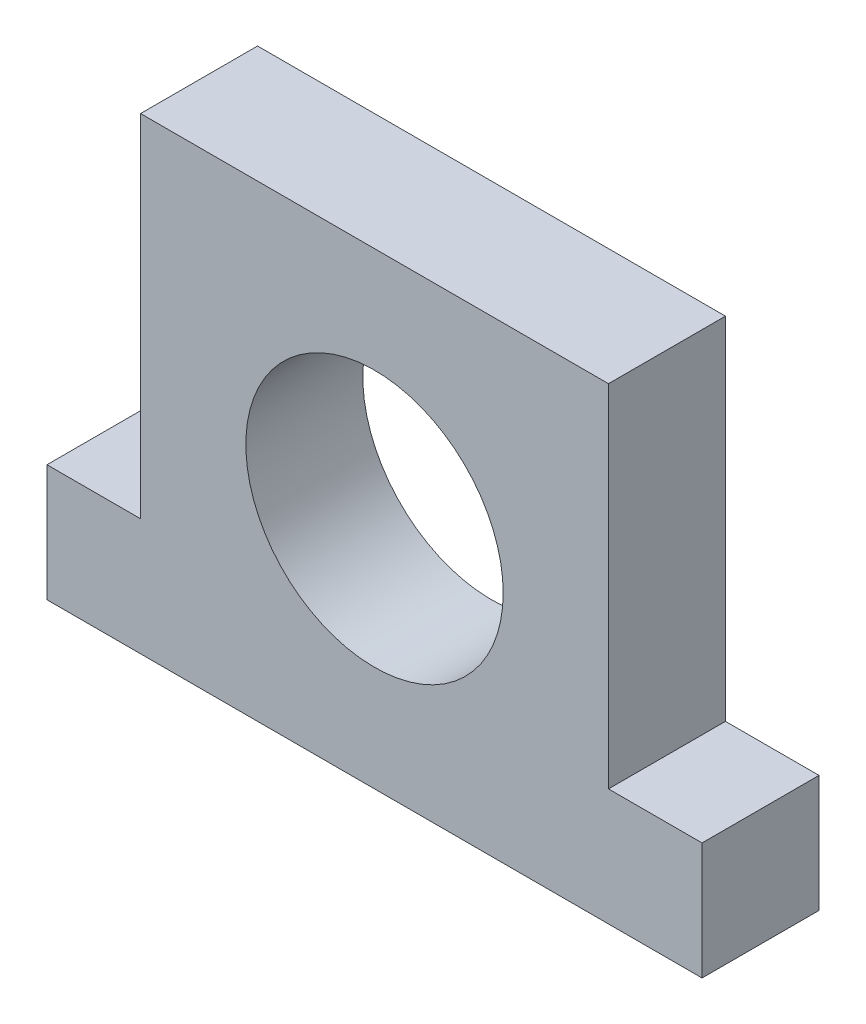
ISO-10303-21;
HEADER;
FILE_DESCRIPTION(('STEP AP214'),'2;1');
FILE_NAME('part.step','',(''),(''),'','','');
FILE_SCHEMA(('AUTOMOTIVE_DESIGN { 1 0 10303 214 1 1 1 1 }'));
ENDSEC;
DATA;
#1=APPLICATION_CONTEXT('core data for automotive mechanical design processes');
#2=APPLICATION_PROTOCOL_DEFINITION('international standard','automotive_design',2000,#1);
#3=PRODUCT_CONTEXT('',#1,'mechanical');
#4=PRODUCT('Part','Part','',(#3));
#5=PRODUCT_RELATED_PRODUCT_CATEGORY('part','',(#4));
#6=PRODUCT_DEFINITION_FORMATION('','',#4);
#7=PRODUCT_DEFINITION_CONTEXT('part definition',#1,'design');
#8=PRODUCT_DEFINITION('design','',#6,#7);
#9=PRODUCT_DEFINITION_SHAPE('','',#8);
#10=(LENGTH_UNIT() NAMED_UNIT(*) SI_UNIT(.MILLI.,.METRE.));
#11=(NAMED_UNIT(*) PLANE_ANGLE_UNIT() SI_UNIT($,.RADIAN.));
#12=(NAMED_UNIT(*) SI_UNIT($,.STERADIAN.) SOLID_ANGLE_UNIT());
#13=UNCERTAINTY_MEASURE_WITH_UNIT(LENGTH_MEASURE(1.E-05),#10,'distance_accuracy_value','');
#14=(GEOMETRIC_REPRESENTATION_CONTEXT(3) GLOBAL_UNCERTAINTY_ASSIGNED_CONTEXT((#13)) GLOBAL_UNIT_ASSIGNED_CONTEXT((#10,
#11,#12)) REPRESENTATION_CONTEXT('',''));
#15=CARTESIAN_POINT('',(0.,0.,0.));
#16=DIRECTION('',(0.,0.,1.));
#17=DIRECTION('',(1.,0.,0.));
#18=AXIS2_PLACEMENT_3D('',#15,#16,#17);
#19=CARTESIAN_POINT('',(0.,0.,10.));
#20=DIRECTION('',(0.,0.,-1.));
#21=DIRECTION('',(-1.,0.,0.));
#22=AXIS2_PLACEMENT_3D('',#19,#20,#21);
#23=PLANE('',#22);
#24=DIRECTION('',(0.,-1.,0.));
#25=VECTOR('',#24,1.);
#26=CARTESIAN_POINT('',(-28.,0.,10.));
#27=LINE('',#26,#25);
#28=CARTESIAN_POINT('',(-28.,10.,10.));
#29=VERTEX_POINT('',#28);
#30=CARTESIAN_POINT('',(-28.,0.,10.));
#31=VERTEX_POINT('',#30);
#32=EDGE_CURVE('E147',#29,#31,#27,.T.);
#33=ORIENTED_EDGE('',*,*,#32,.T.);
#34=DIRECTION('',(1.,0.,0.));
#35=VECTOR('',#34,1.);
#36=CARTESIAN_POINT('',(28.,0.,10.));
#37=LINE('',#36,#35);
#38=CARTESIAN_POINT('',(28.,0.,10.));
#39=VERTEX_POINT('',#38);
#40=EDGE_CURVE('E95',#31,#39,#37,.T.);
#41=ORIENTED_EDGE('',*,*,#40,.T.);
#42=DIRECTION('',(0.,1.,0.));
#43=VECTOR('',#42,1.);
#44=CARTESIAN_POINT('',(28.,0.,10.));
#45=LINE('',#44,#43);
#46=CARTESIAN_POINT('',(28.,10.,10.));
#47=VERTEX_POINT('',#46);
#48=EDGE_CURVE('E162',#39,#47,#45,.T.);
#49=ORIENTED_EDGE('',*,*,#48,.T.);
#50=DIRECTION('',(-1.,0.,0.));
#51=VECTOR('',#50,1.);
#52=CARTESIAN_POINT('',(28.,10.,10.));
#53=LINE('',#52,#51);
#54=CARTESIAN_POINT('',(20.,10.,10.));
#55=VERTEX_POINT('',#54);
#56=EDGE_CURVE('E175',#47,#55,#53,.T.);
#57=ORIENTED_EDGE('',*,*,#56,.T.);
#58=DIRECTION('',(0.,1.,0.));
#59=VECTOR('',#58,1.);
#60=CARTESIAN_POINT('',(20.,10.,10.));
#61=LINE('',#60,#59);
#62=CARTESIAN_POINT('',(20.,40.,10.));
#63=VERTEX_POINT('',#62);
#64=EDGE_CURVE('E114',#55,#63,#61,.T.);
#65=ORIENTED_EDGE('',*,*,#64,.T.);
#66=DIRECTION('',(-1.,0.,0.));
#67=VECTOR('',#66,1.);
#68=CARTESIAN_POINT('',(-20.,40.,10.));
#69=LINE('',#68,#67);
#70=CARTESIAN_POINT('',(-20.,40.,10.));
#71=VERTEX_POINT('',#70);
#72=EDGE_CURVE('E108',#63,#71,#69,.T.);
#73=ORIENTED_EDGE('',*,*,#72,.T.);
#74=DIRECTION('',(0.,-1.,0.));
#75=VECTOR('',#74,1.);
#76=CARTESIAN_POINT('',(-20.,10.,10.));
#77=LINE('',#76,#75);
#78=CARTESIAN_POINT('',(-20.,10.,10.));
#79=VERTEX_POINT('',#78);
#80=EDGE_CURVE('E112',#71,#79,#77,.T.);
#81=ORIENTED_EDGE('',*,*,#80,.T.);
#82=DIRECTION('',(-1.,0.,0.));
#83=VECTOR('',#82,1.);
#84=CARTESIAN_POINT('',(-28.,10.,10.));
#85=LINE('',#84,#83);
#86=EDGE_CURVE('E52',#79,#29,#85,.T.);
#87=ORIENTED_EDGE('',*,*,#86,.T.);
#88=EDGE_LOOP('',(#33,#41,#49,#57,#65,#73,#81,#87));
#89=FACE_BOUND('',#88,.T.);
#90=CARTESIAN_POINT('',(0.,20.,10.));
#91=DIRECTION('',(0.,0.,1.));
#92=DIRECTION('',(1.,0.,0.));
#93=AXIS2_PLACEMENT_3D('',#90,#91,#92);
#94=CIRCLE('',#93,11.);
#95=CARTESIAN_POINT('',(11.,20.,10.));
#96=VERTEX_POINT('',#95);
#97=EDGE_CURVE('E136',#96,#96,#94,.T.);
#98=ORIENTED_EDGE('',*,*,#97,.F.);
#99=EDGE_LOOP('',(#98));
#100=FACE_BOUND('',#99,.T.);
#101=ADVANCED_FACE('F35',(#89,#100),#23,.F.);
#102=CARTESIAN_POINT('',(0.,0.,0.));
#103=DIRECTION('',(0.,0.,-1.));
#104=DIRECTION('',(-1.,0.,0.));
#105=AXIS2_PLACEMENT_3D('',#102,#103,#104);
#106=PLANE('',#105);
#107=DIRECTION('',(0.,-1.,0.));
#108=VECTOR('',#107,1.);
#109=CARTESIAN_POINT('',(-28.,0.,0.));
#110=LINE('',#109,#108);
#111=CARTESIAN_POINT('',(-28.,10.,0.));
#112=VERTEX_POINT('',#111);
#113=CARTESIAN_POINT('',(-28.,0.,0.));
#114=VERTEX_POINT('',#113);
#115=EDGE_CURVE('E132',#112,#114,#110,.T.);
#116=ORIENTED_EDGE('',*,*,#115,.F.);
#117=DIRECTION('',(-1.,0.,0.));
#118=VECTOR('',#117,1.);
#119=CARTESIAN_POINT('',(-28.,10.,0.));
#120=LINE('',#119,#118);
#121=CARTESIAN_POINT('',(-20.,10.,0.));
#122=VERTEX_POINT('',#121);
#123=EDGE_CURVE('E87',#122,#112,#120,.T.);
#124=ORIENTED_EDGE('',*,*,#123,.F.);
#125=DIRECTION('',(0.,-1.,0.));
#126=VECTOR('',#125,1.);
#127=CARTESIAN_POINT('',(-20.,10.,0.));
#128=LINE('',#127,#126);
#129=CARTESIAN_POINT('',(-20.,40.,0.));
#130=VERTEX_POINT('',#129);
#131=EDGE_CURVE('E81',#130,#122,#128,.T.);
#132=ORIENTED_EDGE('',*,*,#131,.F.);
#133=DIRECTION('',(-1.,0.,0.));
#134=VECTOR('',#133,1.);
#135=CARTESIAN_POINT('',(-20.,40.,0.));
#136=LINE('',#135,#134);
#137=CARTESIAN_POINT('',(20.,40.,0.));
#138=VERTEX_POINT('',#137);
#139=EDGE_CURVE('E122',#138,#130,#136,.T.);
#140=ORIENTED_EDGE('',*,*,#139,.F.);
#141=DIRECTION('',(0.,1.,0.));
#142=VECTOR('',#141,1.);
#143=CARTESIAN_POINT('',(20.,10.,0.));
#144=LINE('',#143,#142);
#145=CARTESIAN_POINT('',(20.,10.,0.));
#146=VERTEX_POINT('',#145);
#147=EDGE_CURVE('E142',#146,#138,#144,.T.);
#148=ORIENTED_EDGE('',*,*,#147,.F.);
#149=DIRECTION('',(-1.,0.,0.));
#150=VECTOR('',#149,1.);
#151=CARTESIAN_POINT('',(28.,10.,0.));
#152=LINE('',#151,#150);
#153=CARTESIAN_POINT('',(28.,10.,0.));
#154=VERTEX_POINT('',#153);
#155=EDGE_CURVE('E140',#154,#146,#152,.T.);
#156=ORIENTED_EDGE('',*,*,#155,.F.);
#157=DIRECTION('',(0.,1.,0.));
#158=VECTOR('',#157,1.);
#159=CARTESIAN_POINT('',(28.,0.,0.));
#160=LINE('',#159,#158);
#161=CARTESIAN_POINT('',(28.,0.,0.));
#162=VERTEX_POINT('',#161);
#163=EDGE_CURVE('E138',#162,#154,#160,.T.);
#164=ORIENTED_EDGE('',*,*,#163,.F.);
#165=DIRECTION('',(1.,0.,0.));
#166=VECTOR('',#165,1.);
#167=CARTESIAN_POINT('',(28.,0.,0.));
#168=LINE('',#167,#166);
#169=EDGE_CURVE('E135',#114,#162,#168,.T.);
#170=ORIENTED_EDGE('',*,*,#169,.F.);
#171=EDGE_LOOP('',(#116,#124,#132,#140,#148,#156,#164,#170));
#172=FACE_BOUND('',#171,.T.);
#173=CARTESIAN_POINT('',(0.,20.,0.));
#174=DIRECTION('',(0.,0.,1.));
#175=DIRECTION('',(1.,0.,0.));
#176=AXIS2_PLACEMENT_3D('',#173,#174,#175);
#177=CIRCLE('',#176,11.);
#178=CARTESIAN_POINT('',(11.,20.,0.));
#179=VERTEX_POINT('',#178);
#180=EDGE_CURVE('E181',#179,#179,#177,.T.);
#181=ORIENTED_EDGE('',*,*,#180,.T.);
#182=EDGE_LOOP('',(#181));
#183=FACE_BOUND('',#182,.T.);
#184=ADVANCED_FACE('F166',(#172,#183),#106,.T.);
#185=CARTESIAN_POINT('',(-28.,0.,10.));
#186=DIRECTION('',(1.,0.,0.));
#187=DIRECTION('',(0.,0.,-1.));
#188=AXIS2_PLACEMENT_3D('',#185,#186,#187);
#189=PLANE('',#188);
#190=ORIENTED_EDGE('',*,*,#115,.T.);
#191=DIRECTION('',(0.,0.,-1.));
#192=VECTOR('',#191,1.);
#193=CARTESIAN_POINT('',(-28.,0.,10.));
#194=LINE('',#193,#192);
#195=EDGE_CURVE('E11',#31,#114,#194,.T.);
#196=ORIENTED_EDGE('',*,*,#195,.F.);
#197=ORIENTED_EDGE('',*,*,#32,.F.);
#198=DIRECTION('',(0.,0.,-1.));
#199=VECTOR('',#198,1.);
#200=CARTESIAN_POINT('',(-28.,10.,10.));
#201=LINE('',#200,#199);
#202=EDGE_CURVE('E128',#29,#112,#201,.T.);
#203=ORIENTED_EDGE('',*,*,#202,.T.);
#204=EDGE_LOOP('',(#190,#196,#197,#203));
#205=FACE_BOUND('',#204,.T.);
#206=ADVANCED_FACE('F37',(#205),#189,.F.);
#207=CARTESIAN_POINT('',(28.,0.,10.));
#208=DIRECTION('',(0.,1.,0.));
#209=DIRECTION('',(0.,0.,1.));
#210=AXIS2_PLACEMENT_3D('',#207,#208,#209);
#211=PLANE('',#210);
#212=ORIENTED_EDGE('',*,*,#169,.T.);
#213=DIRECTION('',(0.,0.,-1.));
#214=VECTOR('',#213,1.);
#215=CARTESIAN_POINT('',(28.,0.,10.));
#216=LINE('',#215,#214);
#217=EDGE_CURVE('E44',#39,#162,#216,.T.);
#218=ORIENTED_EDGE('',*,*,#217,.F.);
#219=ORIENTED_EDGE('',*,*,#40,.F.);
#220=ORIENTED_EDGE('',*,*,#195,.T.);
#221=EDGE_LOOP('',(#212,#218,#219,#220));
#222=FACE_BOUND('',#221,.T.);
#223=ADVANCED_FACE('F209',(#222),#211,.F.);
#224=CARTESIAN_POINT('',(28.,0.,10.));
#225=DIRECTION('',(-1.,0.,0.));
#226=DIRECTION('',(0.,0.,1.));
#227=AXIS2_PLACEMENT_3D('',#224,#225,#226);
#228=PLANE('',#227);
#229=ORIENTED_EDGE('',*,*,#163,.T.);
#230=DIRECTION('',(0.,0.,-1.));
#231=VECTOR('',#230,1.);
#232=CARTESIAN_POINT('',(28.,10.,10.));
#233=LINE('',#232,#231);
#234=EDGE_CURVE('E154',#47,#154,#233,.T.);
#235=ORIENTED_EDGE('',*,*,#234,.F.);
#236=ORIENTED_EDGE('',*,*,#48,.F.);
#237=ORIENTED_EDGE('',*,*,#217,.T.);
#238=EDGE_LOOP('',(#229,#235,#236,#237));
#239=FACE_BOUND('',#238,.T.);
#240=ADVANCED_FACE('F160',(#239),#228,.F.);
#241=CARTESIAN_POINT('',(28.,10.,10.));
#242=DIRECTION('',(0.,-1.,0.));
#243=DIRECTION('',(0.,0.,-1.));
#244=AXIS2_PLACEMENT_3D('',#241,#242,#243);
#245=PLANE('',#244);
#246=ORIENTED_EDGE('',*,*,#155,.T.);
#247=DIRECTION('',(0.,0.,-1.));
#248=VECTOR('',#247,1.);
#249=CARTESIAN_POINT('',(20.,10.,10.));
#250=LINE('',#249,#248);
#251=EDGE_CURVE('E151',#55,#146,#250,.T.);
#252=ORIENTED_EDGE('',*,*,#251,.F.);
#253=ORIENTED_EDGE('',*,*,#56,.F.);
#254=ORIENTED_EDGE('',*,*,#234,.T.);
#255=EDGE_LOOP('',(#246,#252,#253,#254));
#256=FACE_BOUND('',#255,.T.);
#257=ADVANCED_FACE('F171',(#256),#245,.F.);
#258=CARTESIAN_POINT('',(20.,10.,10.));
#259=DIRECTION('',(-1.,0.,0.));
#260=DIRECTION('',(0.,0.,1.));
#261=AXIS2_PLACEMENT_3D('',#258,#259,#260);
#262=PLANE('',#261);
#263=ORIENTED_EDGE('',*,*,#147,.T.);
#264=DIRECTION('',(0.,0.,-1.));
#265=VECTOR('',#264,1.);
#266=CARTESIAN_POINT('',(20.,40.,10.));
#267=LINE('',#266,#265);
#268=EDGE_CURVE('E123',#63,#138,#267,.T.);
#269=ORIENTED_EDGE('',*,*,#268,.F.);
#270=ORIENTED_EDGE('',*,*,#64,.F.);
#271=ORIENTED_EDGE('',*,*,#251,.T.);
#272=EDGE_LOOP('',(#263,#269,#270,#271));
#273=FACE_BOUND('',#272,.T.);
#274=ADVANCED_FACE('F174',(#273),#262,.F.);
#275=CARTESIAN_POINT('',(-20.,40.,10.));
#276=DIRECTION('',(0.,-1.,0.));
#277=DIRECTION('',(0.,0.,-1.));
#278=AXIS2_PLACEMENT_3D('',#275,#276,#277);
#279=PLANE('',#278);
#280=ORIENTED_EDGE('',*,*,#139,.T.);
#281=DIRECTION('',(0.,0.,-1.));
#282=VECTOR('',#281,1.);
#283=CARTESIAN_POINT('',(-20.,40.,10.));
#284=LINE('',#283,#282);
#285=EDGE_CURVE('E119',#71,#130,#284,.T.);
#286=ORIENTED_EDGE('',*,*,#285,.F.);
#287=ORIENTED_EDGE('',*,*,#72,.F.);
#288=ORIENTED_EDGE('',*,*,#268,.T.);
#289=EDGE_LOOP('',(#280,#286,#287,#288));
#290=FACE_BOUND('',#289,.T.);
#291=ADVANCED_FACE('F120',(#290),#279,.F.);
#292=CARTESIAN_POINT('',(-20.,10.,10.));
#293=DIRECTION('',(1.,0.,0.));
#294=DIRECTION('',(0.,0.,-1.));
#295=AXIS2_PLACEMENT_3D('',#292,#293,#294);
#296=PLANE('',#295);
#297=ORIENTED_EDGE('',*,*,#131,.T.);
#298=DIRECTION('',(0.,0.,-1.));
#299=VECTOR('',#298,1.);
#300=CARTESIAN_POINT('',(-20.,10.,10.));
#301=LINE('',#300,#299);
#302=EDGE_CURVE('E124',#79,#122,#301,.T.);
#303=ORIENTED_EDGE('',*,*,#302,.F.);
#304=ORIENTED_EDGE('',*,*,#80,.F.);
#305=ORIENTED_EDGE('',*,*,#285,.T.);
#306=EDGE_LOOP('',(#297,#303,#304,#305));
#307=FACE_BOUND('',#306,.T.);
#308=ADVANCED_FACE('F126',(#307),#296,.F.);
#309=CARTESIAN_POINT('',(-28.,10.,10.));
#310=DIRECTION('',(0.,-1.,0.));
#311=DIRECTION('',(0.,0.,-1.));
#312=AXIS2_PLACEMENT_3D('',#309,#310,#311);
#313=PLANE('',#312);
#314=ORIENTED_EDGE('',*,*,#123,.T.);
#315=ORIENTED_EDGE('',*,*,#202,.F.);
#316=ORIENTED_EDGE('',*,*,#86,.F.);
#317=ORIENTED_EDGE('',*,*,#302,.T.);
#318=EDGE_LOOP('',(#314,#315,#316,#317));
#319=FACE_BOUND('',#318,.T.);
#320=ADVANCED_FACE('F197',(#319),#313,.F.);
#321=CARTESIAN_POINT('',(0.,20.,10.));
#322=DIRECTION('',(0.,0.,-1.));
#323=DIRECTION('',(-1.,0.,0.));
#324=AXIS2_PLACEMENT_3D('',#321,#322,#323);
#325=CYLINDRICAL_SURFACE('',#324,11.);
#326=ORIENTED_EDGE('',*,*,#97,.T.);
#327=EDGE_LOOP('',(#326));
#328=FACE_BOUND('',#327,.T.);
#329=ORIENTED_EDGE('',*,*,#180,.F.);
#330=EDGE_LOOP('',(#329));
#331=FACE_BOUND('',#330,.T.);
#332=ADVANCED_FACE('F187',(#328,#331),#325,.F.);
#333=CLOSED_SHELL('',(#101,#184,#206,#223,#240,#257,#274,#291,#308,#320,#332));
#334=MANIFOLD_SOLID_BREP('B2',#333);
#335=ADVANCED_BREP_SHAPE_REPRESENTATION('',(#18,#334),#14);
#336=SHAPE_DEFINITION_REPRESENTATION(#9,#335);
ENDSEC;
END-ISO-10303-21;
